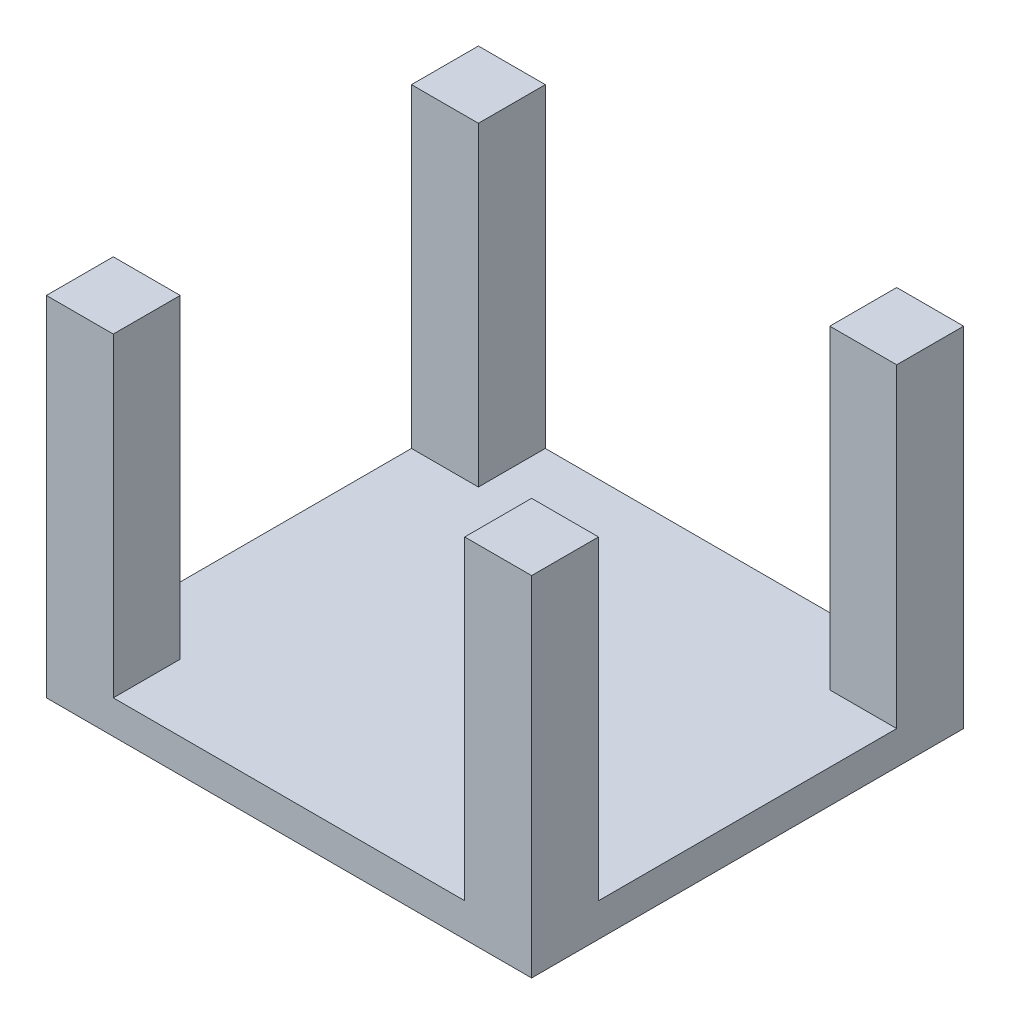
ISO-10303-21;
HEADER;
FILE_DESCRIPTION(('STEP AP214'),'2;1');
FILE_NAME('part.step','',(''),(''),'','','');
FILE_SCHEMA(('AUTOMOTIVE_DESIGN { 1 0 10303 214 1 1 1 1 }'));
ENDSEC;
DATA;
#1=APPLICATION_CONTEXT('core data for automotive mechanical design processes');
#2=APPLICATION_PROTOCOL_DEFINITION('international standard','automotive_design',2000,#1);
#3=PRODUCT_CONTEXT('',#1,'mechanical');
#4=PRODUCT('Part','Part','',(#3));
#5=PRODUCT_RELATED_PRODUCT_CATEGORY('part','',(#4));
#6=PRODUCT_DEFINITION_FORMATION('','',#4);
#7=PRODUCT_DEFINITION_CONTEXT('part definition',#1,'design');
#8=PRODUCT_DEFINITION('design','',#6,#7);
#9=PRODUCT_DEFINITION_SHAPE('','',#8);
#10=(LENGTH_UNIT() NAMED_UNIT(*) SI_UNIT(.MILLI.,.METRE.));
#11=(NAMED_UNIT(*) PLANE_ANGLE_UNIT() SI_UNIT($,.RADIAN.));
#12=(NAMED_UNIT(*) SI_UNIT($,.STERADIAN.) SOLID_ANGLE_UNIT());
#13=UNCERTAINTY_MEASURE_WITH_UNIT(LENGTH_MEASURE(1.E-05),#10,'distance_accuracy_value','');
#14=(GEOMETRIC_REPRESENTATION_CONTEXT(3) GLOBAL_UNCERTAINTY_ASSIGNED_CONTEXT((#13)) GLOBAL_UNIT_ASSIGNED_CONTEXT((#10,
#11,#12)) REPRESENTATION_CONTEXT('',''));
#15=CARTESIAN_POINT('',(0.,0.,0.));
#16=DIRECTION('',(0.,0.,1.));
#17=DIRECTION('',(1.,0.,0.));
#18=AXIS2_PLACEMENT_3D('',#15,#16,#17);
#19=CARTESIAN_POINT('',(0.,6.35,0.));
#20=DIRECTION('',(0.,-1.,0.));
#21=DIRECTION('',(0.,0.,-1.));
#22=AXIS2_PLACEMENT_3D('',#19,#20,#21);
#23=PLANE('',#22);
#24=DIRECTION('',(0.,0.,-1.));
#25=VECTOR('',#24,1.);
#26=CARTESIAN_POINT('',(-33.349999975,6.35,41.));
#27=LINE('',#26,#25);
#28=CARTESIAN_POINT('',(-33.349999975,6.35,41.));
#29=VERTEX_POINT('',#28);
#30=CARTESIAN_POINT('',(-33.349999975,6.35,28.3));
#31=VERTEX_POINT('',#30);
#32=EDGE_CURVE('E173',#29,#31,#27,.T.);
#33=ORIENTED_EDGE('',*,*,#32,.F.);
#34=DIRECTION('',(1.,0.,0.));
#35=VECTOR('',#34,1.);
#36=CARTESIAN_POINT('',(-46.049999975,6.35,41.));
#37=LINE('',#36,#35);
#38=CARTESIAN_POINT('',(33.349999975,6.35,41.));
#39=VERTEX_POINT('',#38);
#40=EDGE_CURVE('E265',#29,#39,#37,.T.);
#41=ORIENTED_EDGE('',*,*,#40,.T.);
#42=DIRECTION('',(0.,0.,1.));
#43=VECTOR('',#42,1.);
#44=CARTESIAN_POINT('',(33.349999975,6.35,41.));
#45=LINE('',#44,#43);
#46=CARTESIAN_POINT('',(33.349999975,6.35,28.3));
#47=VERTEX_POINT('',#46);
#48=EDGE_CURVE('E190',#47,#39,#45,.T.);
#49=ORIENTED_EDGE('',*,*,#48,.F.);
#50=DIRECTION('',(-1.,0.,0.));
#51=VECTOR('',#50,1.);
#52=CARTESIAN_POINT('',(46.049999975,6.35,28.3));
#53=LINE('',#52,#51);
#54=CARTESIAN_POINT('',(46.049999975,6.35,28.3));
#55=VERTEX_POINT('',#54);
#56=EDGE_CURVE('E185',#55,#47,#53,.T.);
#57=ORIENTED_EDGE('',*,*,#56,.F.);
#58=DIRECTION('',(0.,0.,-1.));
#59=VECTOR('',#58,1.);
#60=CARTESIAN_POINT('',(46.049999975,6.35,41.));
#61=LINE('',#60,#59);
#62=CARTESIAN_POINT('',(46.049999975,6.35,-28.3));
#63=VERTEX_POINT('',#62);
#64=EDGE_CURVE('E259',#55,#63,#61,.T.);
#65=ORIENTED_EDGE('',*,*,#64,.T.);
#66=DIRECTION('',(1.,0.,0.));
#67=VECTOR('',#66,1.);
#68=CARTESIAN_POINT('',(46.049999975,6.35,-28.3));
#69=LINE('',#68,#67);
#70=CARTESIAN_POINT('',(33.349999975,6.35,-28.3));
#71=VERTEX_POINT('',#70);
#72=EDGE_CURVE('E214',#71,#63,#69,.T.);
#73=ORIENTED_EDGE('',*,*,#72,.F.);
#74=DIRECTION('',(0.,0.,1.));
#75=VECTOR('',#74,1.);
#76=CARTESIAN_POINT('',(33.349999975,6.35,-41.));
#77=LINE('',#76,#75);
#78=CARTESIAN_POINT('',(33.349999975,6.35,-41.));
#79=VERTEX_POINT('',#78);
#80=EDGE_CURVE('E209',#79,#71,#77,.T.);
#81=ORIENTED_EDGE('',*,*,#80,.F.);
#82=DIRECTION('',(-1.,0.,0.));
#83=VECTOR('',#82,1.);
#84=CARTESIAN_POINT('',(-46.049999975,6.35,-41.));
#85=LINE('',#84,#83);
#86=CARTESIAN_POINT('',(-33.349999975,6.35,-41.));
#87=VERTEX_POINT('',#86);
#88=EDGE_CURVE('E261',#79,#87,#85,.T.);
#89=ORIENTED_EDGE('',*,*,#88,.T.);
#90=DIRECTION('',(0.,0.,-1.));
#91=VECTOR('',#90,1.);
#92=CARTESIAN_POINT('',(-33.349999975,6.35,-41.));
#93=LINE('',#92,#91);
#94=CARTESIAN_POINT('',(-33.349999975,6.35,-28.3));
#95=VERTEX_POINT('',#94);
#96=EDGE_CURVE('E238',#95,#87,#93,.T.);
#97=ORIENTED_EDGE('',*,*,#96,.F.);
#98=DIRECTION('',(1.,0.,0.));
#99=VECTOR('',#98,1.);
#100=CARTESIAN_POINT('',(-46.049999975,6.35,-28.3));
#101=LINE('',#100,#99);
#102=CARTESIAN_POINT('',(-46.049999975,6.35,-28.3));
#103=VERTEX_POINT('',#102);
#104=EDGE_CURVE('E233',#103,#95,#101,.T.);
#105=ORIENTED_EDGE('',*,*,#104,.F.);
#106=DIRECTION('',(0.,0.,1.));
#107=VECTOR('',#106,1.);
#108=CARTESIAN_POINT('',(-46.049999975,6.35,41.));
#109=LINE('',#108,#107);
#110=CARTESIAN_POINT('',(-46.049999975,6.35,28.3));
#111=VERTEX_POINT('',#110);
#112=EDGE_CURVE('E54',#103,#111,#109,.T.);
#113=ORIENTED_EDGE('',*,*,#112,.T.);
#114=DIRECTION('',(-1.,0.,0.));
#115=VECTOR('',#114,1.);
#116=CARTESIAN_POINT('',(-46.049999975,6.35,28.3));
#117=LINE('',#116,#115);
#118=EDGE_CURVE('E49',#31,#111,#117,.T.);
#119=ORIENTED_EDGE('',*,*,#118,.F.);
#120=EDGE_LOOP('',(#33,#41,#49,#57,#65,#73,#81,#89,#97,#105,#113,#119));
#121=FACE_BOUND('',#120,.T.);
#122=ADVANCED_FACE('F34',(#121),#23,.F.);
#123=CARTESIAN_POINT('',(46.049999975,6.35,41.));
#124=DIRECTION('',(-1.,0.,0.));
#125=DIRECTION('',(0.,0.,1.));
#126=AXIS2_PLACEMENT_3D('',#123,#124,#125);
#127=PLANE('',#126);
#128=DIRECTION('',(0.,0.,-1.));
#129=VECTOR('',#128,1.);
#130=CARTESIAN_POINT('',(46.049999975,0.,41.));
#131=LINE('',#130,#129);
#132=CARTESIAN_POINT('',(46.049999975,0.,41.));
#133=VERTEX_POINT('',#132);
#134=CARTESIAN_POINT('',(46.049999975,0.,-41.));
#135=VERTEX_POINT('',#134);
#136=EDGE_CURVE('E258',#133,#135,#131,.T.);
#137=ORIENTED_EDGE('',*,*,#136,.T.);
#138=DIRECTION('',(0.,-1.,0.));
#139=VECTOR('',#138,1.);
#140=CARTESIAN_POINT('',(46.049999975,6.35,-41.));
#141=LINE('',#140,#139);
#142=CARTESIAN_POINT('',(46.049999975,66.15,-41.));
#143=VERTEX_POINT('',#142);
#144=EDGE_CURVE('E11',#143,#135,#141,.T.);
#145=ORIENTED_EDGE('',*,*,#144,.F.);
#146=DIRECTION('',(0.,0.,-1.));
#147=VECTOR('',#146,1.);
#148=CARTESIAN_POINT('',(46.049999975,66.15,-41.));
#149=LINE('',#148,#147);
#150=CARTESIAN_POINT('',(46.049999975,66.15,-28.3));
#151=VERTEX_POINT('',#150);
#152=EDGE_CURVE('E210',#151,#143,#149,.T.);
#153=ORIENTED_EDGE('',*,*,#152,.F.);
#154=DIRECTION('',(0.,-1.,0.));
#155=VECTOR('',#154,1.);
#156=CARTESIAN_POINT('',(46.049999975,66.15,-28.3));
#157=LINE('',#156,#155);
#158=EDGE_CURVE('E220',#151,#63,#157,.T.);
#159=ORIENTED_EDGE('',*,*,#158,.T.);
#160=ORIENTED_EDGE('',*,*,#64,.F.);
#161=DIRECTION('',(0.,-1.,0.));
#162=VECTOR('',#161,1.);
#163=CARTESIAN_POINT('',(46.049999975,66.15,28.3));
#164=LINE('',#163,#162);
#165=CARTESIAN_POINT('',(46.049999975,66.15,28.3));
#166=VERTEX_POINT('',#165);
#167=EDGE_CURVE('E206',#166,#55,#164,.T.);
#168=ORIENTED_EDGE('',*,*,#167,.F.);
#169=DIRECTION('',(0.,0.,-1.));
#170=VECTOR('',#169,1.);
#171=CARTESIAN_POINT('',(46.049999975,66.15,41.));
#172=LINE('',#171,#170);
#173=CARTESIAN_POINT('',(46.049999975,66.15,41.));
#174=VERTEX_POINT('',#173);
#175=EDGE_CURVE('E189',#174,#166,#172,.T.);
#176=ORIENTED_EDGE('',*,*,#175,.F.);
#177=DIRECTION('',(0.,-1.,0.));
#178=VECTOR('',#177,1.);
#179=CARTESIAN_POINT('',(46.049999975,6.35,41.));
#180=LINE('',#179,#178);
#181=EDGE_CURVE('E157',#174,#133,#180,.T.);
#182=ORIENTED_EDGE('',*,*,#181,.T.);
#183=EDGE_LOOP('',(#137,#145,#153,#159,#160,#168,#176,#182));
#184=FACE_BOUND('',#183,.T.);
#185=ADVANCED_FACE('F36',(#184),#127,.F.);
#186=CARTESIAN_POINT('',(-46.049999975,6.35,-41.));
#187=DIRECTION('',(0.,0.,1.));
#188=DIRECTION('',(1.,0.,0.));
#189=AXIS2_PLACEMENT_3D('',#186,#187,#188);
#190=PLANE('',#189);
#191=DIRECTION('',(-1.,0.,0.));
#192=VECTOR('',#191,1.);
#193=CARTESIAN_POINT('',(-46.049999975,0.,-41.));
#194=LINE('',#193,#192);
#195=CARTESIAN_POINT('',(-46.049999975,0.,-41.));
#196=VERTEX_POINT('',#195);
#197=EDGE_CURVE('E269',#135,#196,#194,.T.);
#198=ORIENTED_EDGE('',*,*,#197,.T.);
#199=DIRECTION('',(0.,-1.,0.));
#200=VECTOR('',#199,1.);
#201=CARTESIAN_POINT('',(-46.049999975,6.35,-41.));
#202=LINE('',#201,#200);
#203=CARTESIAN_POINT('',(-46.049999975,66.15,-41.));
#204=VERTEX_POINT('',#203);
#205=EDGE_CURVE('E42',#204,#196,#202,.T.);
#206=ORIENTED_EDGE('',*,*,#205,.F.);
#207=DIRECTION('',(-1.,0.,0.));
#208=VECTOR('',#207,1.);
#209=CARTESIAN_POINT('',(-46.049999975,66.15,-41.));
#210=LINE('',#209,#208);
#211=CARTESIAN_POINT('',(-33.349999975,66.15,-41.));
#212=VERTEX_POINT('',#211);
#213=EDGE_CURVE('E242',#212,#204,#210,.T.);
#214=ORIENTED_EDGE('',*,*,#213,.F.);
#215=DIRECTION('',(0.,-1.,0.));
#216=VECTOR('',#215,1.);
#217=CARTESIAN_POINT('',(-33.349999975,66.15,-41.));
#218=LINE('',#217,#216);
#219=EDGE_CURVE('E245',#212,#87,#218,.T.);
#220=ORIENTED_EDGE('',*,*,#219,.T.);
#221=ORIENTED_EDGE('',*,*,#88,.F.);
#222=DIRECTION('',(0.,-1.,0.));
#223=VECTOR('',#222,1.);
#224=CARTESIAN_POINT('',(33.349999975,66.15,-41.));
#225=LINE('',#224,#223);
#226=CARTESIAN_POINT('',(33.349999975,66.15,-41.));
#227=VERTEX_POINT('',#226);
#228=EDGE_CURVE('E230',#227,#79,#225,.T.);
#229=ORIENTED_EDGE('',*,*,#228,.F.);
#230=DIRECTION('',(-1.,0.,0.));
#231=VECTOR('',#230,1.);
#232=CARTESIAN_POINT('',(46.049999975,66.15,-41.));
#233=LINE('',#232,#231);
#234=EDGE_CURVE('E213',#143,#227,#233,.T.);
#235=ORIENTED_EDGE('',*,*,#234,.F.);
#236=ORIENTED_EDGE('',*,*,#144,.T.);
#237=EDGE_LOOP('',(#198,#206,#214,#220,#221,#229,#235,#236));
#238=FACE_BOUND('',#237,.T.);
#239=ADVANCED_FACE('F312',(#238),#190,.F.);
#240=CARTESIAN_POINT('',(-46.049999975,6.35,41.));
#241=DIRECTION('',(1.,0.,0.));
#242=DIRECTION('',(0.,0.,-1.));
#243=AXIS2_PLACEMENT_3D('',#240,#241,#242);
#244=PLANE('',#243);
#245=DIRECTION('',(0.,0.,1.));
#246=VECTOR('',#245,1.);
#247=CARTESIAN_POINT('',(-46.049999975,0.,41.));
#248=LINE('',#247,#246);
#249=CARTESIAN_POINT('',(-46.049999975,0.,41.));
#250=VERTEX_POINT('',#249);
#251=EDGE_CURVE('E154',#196,#250,#248,.T.);
#252=ORIENTED_EDGE('',*,*,#251,.T.);
#253=DIRECTION('',(0.,-1.,0.));
#254=VECTOR('',#253,1.);
#255=CARTESIAN_POINT('',(-46.049999975,6.35,41.));
#256=LINE('',#255,#254);
#257=CARTESIAN_POINT('',(-46.049999975,66.15,41.));
#258=VERTEX_POINT('',#257);
#259=EDGE_CURVE('E146',#258,#250,#256,.T.);
#260=ORIENTED_EDGE('',*,*,#259,.F.);
#261=DIRECTION('',(0.,0.,1.));
#262=VECTOR('',#261,1.);
#263=CARTESIAN_POINT('',(-46.049999975,66.15,41.));
#264=LINE('',#263,#262);
#265=CARTESIAN_POINT('',(-46.049999975,66.15,28.3));
#266=VERTEX_POINT('',#265);
#267=EDGE_CURVE('E151',#266,#258,#264,.T.);
#268=ORIENTED_EDGE('',*,*,#267,.F.);
#269=DIRECTION('',(0.,-1.,0.));
#270=VECTOR('',#269,1.);
#271=CARTESIAN_POINT('',(-46.049999975,66.15,28.3));
#272=LINE('',#271,#270);
#273=EDGE_CURVE('E178',#266,#111,#272,.T.);
#274=ORIENTED_EDGE('',*,*,#273,.T.);
#275=ORIENTED_EDGE('',*,*,#112,.F.);
#276=DIRECTION('',(0.,-1.,0.));
#277=VECTOR('',#276,1.);
#278=CARTESIAN_POINT('',(-46.049999975,66.15,-28.3));
#279=LINE('',#278,#277);
#280=CARTESIAN_POINT('',(-46.049999975,66.15,-28.3));
#281=VERTEX_POINT('',#280);
#282=EDGE_CURVE('E255',#281,#103,#279,.T.);
#283=ORIENTED_EDGE('',*,*,#282,.F.);
#284=DIRECTION('',(0.,0.,1.));
#285=VECTOR('',#284,1.);
#286=CARTESIAN_POINT('',(-46.049999975,66.15,-41.));
#287=LINE('',#286,#285);
#288=EDGE_CURVE('E234',#204,#281,#287,.T.);
#289=ORIENTED_EDGE('',*,*,#288,.F.);
#290=ORIENTED_EDGE('',*,*,#205,.T.);
#291=EDGE_LOOP('',(#252,#260,#268,#274,#275,#283,#289,#290));
#292=FACE_BOUND('',#291,.T.);
#293=ADVANCED_FACE('F148',(#292),#244,.F.);
#294=CARTESIAN_POINT('',(-46.049999975,6.35,41.));
#295=DIRECTION('',(0.,0.,-1.));
#296=DIRECTION('',(-1.,0.,0.));
#297=AXIS2_PLACEMENT_3D('',#294,#295,#296);
#298=PLANE('',#297);
#299=DIRECTION('',(1.,0.,0.));
#300=VECTOR('',#299,1.);
#301=CARTESIAN_POINT('',(-46.049999975,0.,41.));
#302=LINE('',#301,#300);
#303=EDGE_CURVE('E262',#250,#133,#302,.T.);
#304=ORIENTED_EDGE('',*,*,#303,.T.);
#305=ORIENTED_EDGE('',*,*,#181,.F.);
#306=DIRECTION('',(1.,0.,0.));
#307=VECTOR('',#306,1.);
#308=CARTESIAN_POINT('',(46.049999975,66.15,41.));
#309=LINE('',#308,#307);
#310=CARTESIAN_POINT('',(33.349999975,66.15,41.));
#311=VERTEX_POINT('',#310);
#312=EDGE_CURVE('E186',#311,#174,#309,.T.);
#313=ORIENTED_EDGE('',*,*,#312,.F.);
#314=DIRECTION('',(0.,-1.,0.));
#315=VECTOR('',#314,1.);
#316=CARTESIAN_POINT('',(33.349999975,66.15,41.));
#317=LINE('',#316,#315);
#318=EDGE_CURVE('E196',#311,#39,#317,.T.);
#319=ORIENTED_EDGE('',*,*,#318,.T.);
#320=ORIENTED_EDGE('',*,*,#40,.F.);
#321=DIRECTION('',(0.,-1.,0.));
#322=VECTOR('',#321,1.);
#323=CARTESIAN_POINT('',(-33.349999975,66.15,41.));
#324=LINE('',#323,#322);
#325=CARTESIAN_POINT('',(-33.349999975,66.15,41.));
#326=VERTEX_POINT('',#325);
#327=EDGE_CURVE('E163',#326,#29,#324,.T.);
#328=ORIENTED_EDGE('',*,*,#327,.F.);
#329=DIRECTION('',(1.,0.,0.));
#330=VECTOR('',#329,1.);
#331=CARTESIAN_POINT('',(-46.049999975,66.15,41.));
#332=LINE('',#331,#330);
#333=EDGE_CURVE('E160',#258,#326,#332,.T.);
#334=ORIENTED_EDGE('',*,*,#333,.F.);
#335=ORIENTED_EDGE('',*,*,#259,.T.);
#336=EDGE_LOOP('',(#304,#305,#313,#319,#320,#328,#334,#335));
#337=FACE_BOUND('',#336,.T.);
#338=ADVANCED_FACE('F161',(#337),#298,.F.);
#339=CARTESIAN_POINT('',(0.,0.,0.));
#340=DIRECTION('',(0.,-1.,0.));
#341=DIRECTION('',(0.,0.,-1.));
#342=AXIS2_PLACEMENT_3D('',#339,#340,#341);
#343=PLANE('',#342);
#344=ORIENTED_EDGE('',*,*,#136,.F.);
#345=ORIENTED_EDGE('',*,*,#303,.F.);
#346=ORIENTED_EDGE('',*,*,#251,.F.);
#347=ORIENTED_EDGE('',*,*,#197,.F.);
#348=EDGE_LOOP('',(#344,#345,#346,#347));
#349=FACE_BOUND('',#348,.T.);
#350=ADVANCED_FACE('F280',(#349),#343,.T.);
#351=CARTESIAN_POINT('',(-46.049999975,66.15,-28.3));
#352=DIRECTION('',(0.,0.,-1.));
#353=DIRECTION('',(-1.,0.,0.));
#354=AXIS2_PLACEMENT_3D('',#351,#352,#353);
#355=PLANE('',#354);
#356=ORIENTED_EDGE('',*,*,#104,.T.);
#357=DIRECTION('',(0.,-1.,0.));
#358=VECTOR('',#357,1.);
#359=CARTESIAN_POINT('',(-33.349999975,66.15,-28.3));
#360=LINE('',#359,#358);
#361=CARTESIAN_POINT('',(-33.349999975,66.15,-28.3));
#362=VERTEX_POINT('',#361);
#363=EDGE_CURVE('E252',#362,#95,#360,.T.);
#364=ORIENTED_EDGE('',*,*,#363,.F.);
#365=DIRECTION('',(1.,0.,0.));
#366=VECTOR('',#365,1.);
#367=CARTESIAN_POINT('',(-46.049999975,66.15,-28.3));
#368=LINE('',#367,#366);
#369=EDGE_CURVE('E237',#281,#362,#368,.T.);
#370=ORIENTED_EDGE('',*,*,#369,.F.);
#371=ORIENTED_EDGE('',*,*,#282,.T.);
#372=EDGE_LOOP('',(#356,#364,#370,#371));
#373=FACE_BOUND('',#372,.T.);
#374=ADVANCED_FACE('F315',(#373),#355,.F.);
#375=CARTESIAN_POINT('',(-33.349999975,66.15,-41.));
#376=DIRECTION('',(-1.,0.,0.));
#377=DIRECTION('',(0.,0.,1.));
#378=AXIS2_PLACEMENT_3D('',#375,#376,#377);
#379=PLANE('',#378);
#380=ORIENTED_EDGE('',*,*,#96,.T.);
#381=ORIENTED_EDGE('',*,*,#219,.F.);
#382=DIRECTION('',(0.,0.,-1.));
#383=VECTOR('',#382,1.);
#384=CARTESIAN_POINT('',(-33.349999975,66.15,-41.));
#385=LINE('',#384,#383);
#386=EDGE_CURVE('E240',#362,#212,#385,.T.);
#387=ORIENTED_EDGE('',*,*,#386,.F.);
#388=ORIENTED_EDGE('',*,*,#363,.T.);
#389=EDGE_LOOP('',(#380,#381,#387,#388));
#390=FACE_BOUND('',#389,.T.);
#391=ADVANCED_FACE('F338',(#390),#379,.F.);
#392=CARTESIAN_POINT('',(0.,66.15,0.));
#393=DIRECTION('',(0.,1.,0.));
#394=DIRECTION('',(0.,0.,1.));
#395=AXIS2_PLACEMENT_3D('',#392,#393,#394);
#396=PLANE('',#395);
#397=ORIENTED_EDGE('',*,*,#288,.T.);
#398=ORIENTED_EDGE('',*,*,#369,.T.);
#399=ORIENTED_EDGE('',*,*,#386,.T.);
#400=ORIENTED_EDGE('',*,*,#213,.T.);
#401=EDGE_LOOP('',(#397,#398,#399,#400));
#402=FACE_BOUND('',#401,.T.);
#403=ADVANCED_FACE('F406',(#402),#396,.T.);
#404=CARTESIAN_POINT('',(33.349999975,66.15,-41.));
#405=DIRECTION('',(1.,0.,0.));
#406=DIRECTION('',(0.,0.,-1.));
#407=AXIS2_PLACEMENT_3D('',#404,#405,#406);
#408=PLANE('',#407);
#409=ORIENTED_EDGE('',*,*,#80,.T.);
#410=DIRECTION('',(0.,-1.,0.));
#411=VECTOR('',#410,1.);
#412=CARTESIAN_POINT('',(33.349999975,66.15,-28.3));
#413=LINE('',#412,#411);
#414=CARTESIAN_POINT('',(33.349999975,66.15,-28.3));
#415=VERTEX_POINT('',#414);
#416=EDGE_CURVE('E227',#415,#71,#413,.T.);
#417=ORIENTED_EDGE('',*,*,#416,.F.);
#418=DIRECTION('',(0.,0.,1.));
#419=VECTOR('',#418,1.);
#420=CARTESIAN_POINT('',(33.349999975,66.15,-41.));
#421=LINE('',#420,#419);
#422=EDGE_CURVE('E216',#227,#415,#421,.T.);
#423=ORIENTED_EDGE('',*,*,#422,.F.);
#424=ORIENTED_EDGE('',*,*,#228,.T.);
#425=EDGE_LOOP('',(#409,#417,#423,#424));
#426=FACE_BOUND('',#425,.T.);
#427=ADVANCED_FACE('F335',(#426),#408,.F.);
#428=CARTESIAN_POINT('',(46.049999975,66.15,-28.3));
#429=DIRECTION('',(0.,0.,-1.));
#430=DIRECTION('',(-1.,0.,0.));
#431=AXIS2_PLACEMENT_3D('',#428,#429,#430);
#432=PLANE('',#431);
#433=ORIENTED_EDGE('',*,*,#72,.T.);
#434=ORIENTED_EDGE('',*,*,#158,.F.);
#435=DIRECTION('',(1.,0.,0.));
#436=VECTOR('',#435,1.);
#437=CARTESIAN_POINT('',(46.049999975,66.15,-28.3));
#438=LINE('',#437,#436);
#439=EDGE_CURVE('E218',#415,#151,#438,.T.);
#440=ORIENTED_EDGE('',*,*,#439,.F.);
#441=ORIENTED_EDGE('',*,*,#416,.T.);
#442=EDGE_LOOP('',(#433,#434,#440,#441));
#443=FACE_BOUND('',#442,.T.);
#444=ADVANCED_FACE('F304',(#443),#432,.F.);
#445=CARTESIAN_POINT('',(0.,66.15,0.));
#446=DIRECTION('',(0.,-1.,0.));
#447=DIRECTION('',(0.,0.,-1.));
#448=AXIS2_PLACEMENT_3D('',#445,#446,#447);
#449=PLANE('',#448);
#450=ORIENTED_EDGE('',*,*,#152,.T.);
#451=ORIENTED_EDGE('',*,*,#234,.T.);
#452=ORIENTED_EDGE('',*,*,#422,.T.);
#453=ORIENTED_EDGE('',*,*,#439,.T.);
#454=EDGE_LOOP('',(#450,#451,#452,#453));
#455=FACE_BOUND('',#454,.T.);
#456=ADVANCED_FACE('F297',(#455),#449,.F.);
#457=CARTESIAN_POINT('',(46.049999975,66.15,28.3));
#458=DIRECTION('',(0.,0.,1.));
#459=DIRECTION('',(1.,0.,0.));
#460=AXIS2_PLACEMENT_3D('',#457,#458,#459);
#461=PLANE('',#460);
#462=ORIENTED_EDGE('',*,*,#56,.T.);
#463=DIRECTION('',(0.,-1.,0.));
#464=VECTOR('',#463,1.);
#465=CARTESIAN_POINT('',(33.349999975,66.15,28.3));
#466=LINE('',#465,#464);
#467=CARTESIAN_POINT('',(33.349999975,66.15,28.3));
#468=VERTEX_POINT('',#467);
#469=EDGE_CURVE('E203',#468,#47,#466,.T.);
#470=ORIENTED_EDGE('',*,*,#469,.F.);
#471=DIRECTION('',(-1.,0.,0.));
#472=VECTOR('',#471,1.);
#473=CARTESIAN_POINT('',(46.049999975,66.15,28.3));
#474=LINE('',#473,#472);
#475=EDGE_CURVE('E192',#166,#468,#474,.T.);
#476=ORIENTED_EDGE('',*,*,#475,.F.);
#477=ORIENTED_EDGE('',*,*,#167,.T.);
#478=EDGE_LOOP('',(#462,#470,#476,#477));
#479=FACE_BOUND('',#478,.T.);
#480=ADVANCED_FACE('F295',(#479),#461,.F.);
#481=CARTESIAN_POINT('',(33.349999975,66.15,41.));
#482=DIRECTION('',(1.,0.,0.));
#483=DIRECTION('',(0.,0.,-1.));
#484=AXIS2_PLACEMENT_3D('',#481,#482,#483);
#485=PLANE('',#484);
#486=ORIENTED_EDGE('',*,*,#48,.T.);
#487=ORIENTED_EDGE('',*,*,#318,.F.);
#488=DIRECTION('',(0.,0.,1.));
#489=VECTOR('',#488,1.);
#490=CARTESIAN_POINT('',(33.349999975,66.15,41.));
#491=LINE('',#490,#489);
#492=EDGE_CURVE('E194',#468,#311,#491,.T.);
#493=ORIENTED_EDGE('',*,*,#492,.F.);
#494=ORIENTED_EDGE('',*,*,#469,.T.);
#495=EDGE_LOOP('',(#486,#487,#493,#494));
#496=FACE_BOUND('',#495,.T.);
#497=ADVANCED_FACE('F292',(#496),#485,.F.);
#498=CARTESIAN_POINT('',(0.,66.15,0.));
#499=DIRECTION('',(0.,-1.,0.));
#500=DIRECTION('',(0.,0.,-1.));
#501=AXIS2_PLACEMENT_3D('',#498,#499,#500);
#502=PLANE('',#501);
#503=ORIENTED_EDGE('',*,*,#312,.T.);
#504=ORIENTED_EDGE('',*,*,#175,.T.);
#505=ORIENTED_EDGE('',*,*,#475,.T.);
#506=ORIENTED_EDGE('',*,*,#492,.T.);
#507=EDGE_LOOP('',(#503,#504,#505,#506));
#508=FACE_BOUND('',#507,.T.);
#509=ADVANCED_FACE('F288',(#508),#502,.F.);
#510=CARTESIAN_POINT('',(-33.349999975,66.15,41.));
#511=DIRECTION('',(-1.,0.,0.));
#512=DIRECTION('',(0.,0.,1.));
#513=AXIS2_PLACEMENT_3D('',#510,#511,#512);
#514=PLANE('',#513);
#515=ORIENTED_EDGE('',*,*,#32,.T.);
#516=DIRECTION('',(0.,-1.,0.));
#517=VECTOR('',#516,1.);
#518=CARTESIAN_POINT('',(-33.349999975,66.15,28.3));
#519=LINE('',#518,#517);
#520=CARTESIAN_POINT('',(-33.349999975,66.15,28.3));
#521=VERTEX_POINT('',#520);
#522=EDGE_CURVE('E181',#521,#31,#519,.T.);
#523=ORIENTED_EDGE('',*,*,#522,.F.);
#524=DIRECTION('',(0.,0.,-1.));
#525=VECTOR('',#524,1.);
#526=CARTESIAN_POINT('',(-33.349999975,66.15,41.));
#527=LINE('',#526,#525);
#528=EDGE_CURVE('E166',#326,#521,#527,.T.);
#529=ORIENTED_EDGE('',*,*,#528,.F.);
#530=ORIENTED_EDGE('',*,*,#327,.T.);
#531=EDGE_LOOP('',(#515,#523,#529,#530));
#532=FACE_BOUND('',#531,.T.);
#533=ADVANCED_FACE('F346',(#532),#514,.F.);
#534=CARTESIAN_POINT('',(-46.049999975,66.15,28.3));
#535=DIRECTION('',(0.,0.,1.));
#536=DIRECTION('',(1.,0.,0.));
#537=AXIS2_PLACEMENT_3D('',#534,#535,#536);
#538=PLANE('',#537);
#539=ORIENTED_EDGE('',*,*,#118,.T.);
#540=ORIENTED_EDGE('',*,*,#273,.F.);
#541=DIRECTION('',(-1.,0.,0.));
#542=VECTOR('',#541,1.);
#543=CARTESIAN_POINT('',(-46.049999975,66.15,28.3));
#544=LINE('',#543,#542);
#545=EDGE_CURVE('E170',#521,#266,#544,.T.);
#546=ORIENTED_EDGE('',*,*,#545,.F.);
#547=ORIENTED_EDGE('',*,*,#522,.T.);
#548=EDGE_LOOP('',(#539,#540,#546,#547));
#549=FACE_BOUND('',#548,.T.);
#550=ADVANCED_FACE('F343',(#549),#538,.F.);
#551=CARTESIAN_POINT('',(0.,66.15,0.));
#552=DIRECTION('',(0.,-1.,0.));
#553=DIRECTION('',(0.,0.,-1.));
#554=AXIS2_PLACEMENT_3D('',#551,#552,#553);
#555=PLANE('',#554);
#556=ORIENTED_EDGE('',*,*,#267,.T.);
#557=ORIENTED_EDGE('',*,*,#333,.T.);
#558=ORIENTED_EDGE('',*,*,#528,.T.);
#559=ORIENTED_EDGE('',*,*,#545,.T.);
#560=EDGE_LOOP('',(#556,#557,#558,#559));
#561=FACE_BOUND('',#560,.T.);
#562=ADVANCED_FACE('F168',(#561),#555,.F.);
#563=CLOSED_SHELL('',(#122,#185,#239,#293,#338,#350,#374,#391,#403,#427,#444,#456,#480,#497,
#509,#533,#550,#562));
#564=MANIFOLD_SOLID_BREP('B2',#563);
#565=ADVANCED_BREP_SHAPE_REPRESENTATION('',(#18,#564),#14);
#566=SHAPE_DEFINITION_REPRESENTATION(#9,#565);
ENDSEC;
END-ISO-10303-21;
